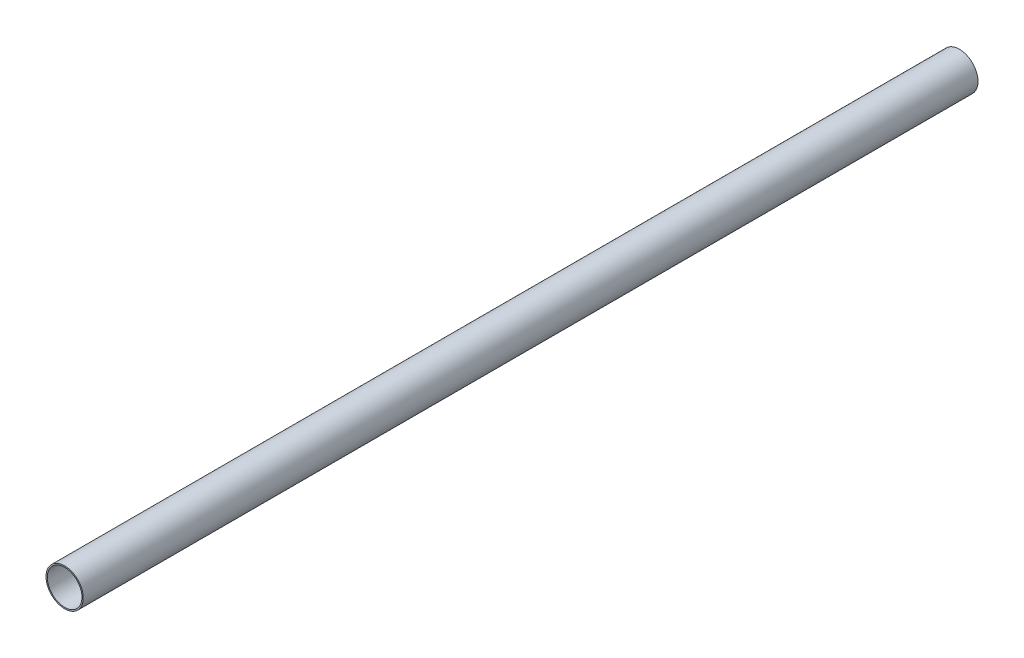
ISO-10303-21;
HEADER;
FILE_DESCRIPTION(('STEP AP214'),'2;1');
FILE_NAME('part.step','',(''),(''),'','','');
FILE_SCHEMA(('AUTOMOTIVE_DESIGN { 1 0 10303 214 1 1 1 1 }'));
ENDSEC;
DATA;
#1=APPLICATION_CONTEXT('core data for automotive mechanical design processes');
#2=APPLICATION_PROTOCOL_DEFINITION('international standard','automotive_design',2000,#1);
#3=PRODUCT_CONTEXT('',#1,'mechanical');
#4=PRODUCT('Part','Part','',(#3));
#5=PRODUCT_RELATED_PRODUCT_CATEGORY('part','',(#4));
#6=PRODUCT_DEFINITION_FORMATION('','',#4);
#7=PRODUCT_DEFINITION_CONTEXT('part definition',#1,'design');
#8=PRODUCT_DEFINITION('design','',#6,#7);
#9=PRODUCT_DEFINITION_SHAPE('','',#8);
#10=(LENGTH_UNIT() NAMED_UNIT(*) SI_UNIT(.MILLI.,.METRE.));
#11=(NAMED_UNIT(*) PLANE_ANGLE_UNIT() SI_UNIT($,.RADIAN.));
#12=(NAMED_UNIT(*) SI_UNIT($,.STERADIAN.) SOLID_ANGLE_UNIT());
#13=UNCERTAINTY_MEASURE_WITH_UNIT(LENGTH_MEASURE(1.E-05),#10,'distance_accuracy_value','');
#14=(GEOMETRIC_REPRESENTATION_CONTEXT(3) GLOBAL_UNCERTAINTY_ASSIGNED_CONTEXT((#13)) GLOBAL_UNIT_ASSIGNED_CONTEXT((#10,
#11,#12)) REPRESENTATION_CONTEXT('',''));
#15=CARTESIAN_POINT('',(0.,0.,0.));
#16=DIRECTION('',(0.,0.,1.));
#17=DIRECTION('',(1.,0.,0.));
#18=AXIS2_PLACEMENT_3D('',#15,#16,#17);
#19=CARTESIAN_POINT('',(0.,0.,304.8));
#20=DIRECTION('',(0.,0.,1.));
#21=DIRECTION('',(1.,0.,0.));
#22=AXIS2_PLACEMENT_3D('',#19,#20,#21);
#23=PLANE('',#22);
#24=CARTESIAN_POINT('',(0.,0.,304.8));
#25=DIRECTION('',(0.,0.,1.));
#26=DIRECTION('',(1.,0.,0.));
#27=AXIS2_PLACEMENT_3D('',#24,#25,#26);
#28=CIRCLE('',#27,12.7);
#29=CARTESIAN_POINT('',(-12.7,0.,304.8));
#30=VERTEX_POINT('',#29);
#31=EDGE_CURVE('E10',#30,#30,#28,.T.);
#32=ORIENTED_EDGE('',*,*,#31,.T.);
#33=EDGE_LOOP('',(#32));
#34=FACE_BOUND('',#33,.T.);
#35=CARTESIAN_POINT('',(0.,0.,304.8));
#36=DIRECTION('',(0.,0.,1.));
#37=DIRECTION('',(1.,0.,0.));
#38=AXIS2_PLACEMENT_3D('',#35,#36,#37);
#39=CIRCLE('',#38,11.811);
#40=CARTESIAN_POINT('',(-11.811,0.,304.8));
#41=VERTEX_POINT('',#40);
#42=EDGE_CURVE('E54',#41,#41,#39,.T.);
#43=ORIENTED_EDGE('',*,*,#42,.F.);
#44=EDGE_LOOP('',(#43));
#45=FACE_BOUND('',#44,.T.);
#46=ADVANCED_FACE('F39',(#34,#45),#23,.T.);
#47=CARTESIAN_POINT('',(0.,0.,-304.8));
#48=DIRECTION('',(0.,0.,1.));
#49=DIRECTION('',(1.,0.,0.));
#50=AXIS2_PLACEMENT_3D('',#47,#48,#49);
#51=PLANE('',#50);
#52=CARTESIAN_POINT('',(0.,0.,-304.8));
#53=DIRECTION('',(0.,0.,1.));
#54=DIRECTION('',(1.,0.,0.));
#55=AXIS2_PLACEMENT_3D('',#52,#53,#54);
#56=CIRCLE('',#55,12.7);
#57=CARTESIAN_POINT('',(-12.7,0.,-304.8));
#58=VERTEX_POINT('',#57);
#59=EDGE_CURVE('E43',#58,#58,#56,.T.);
#60=ORIENTED_EDGE('',*,*,#59,.F.);
#61=EDGE_LOOP('',(#60));
#62=FACE_BOUND('',#61,.T.);
#63=CARTESIAN_POINT('',(0.,0.,-304.8));
#64=DIRECTION('',(0.,0.,1.));
#65=DIRECTION('',(1.,0.,0.));
#66=AXIS2_PLACEMENT_3D('',#63,#64,#65);
#67=CIRCLE('',#66,11.811);
#68=CARTESIAN_POINT('',(-11.811,0.,-304.8));
#69=VERTEX_POINT('',#68);
#70=EDGE_CURVE('E56',#69,#69,#67,.T.);
#71=ORIENTED_EDGE('',*,*,#70,.T.);
#72=EDGE_LOOP('',(#71));
#73=FACE_BOUND('',#72,.T.);
#74=ADVANCED_FACE('F66',(#62,#73),#51,.F.);
#75=CARTESIAN_POINT('',(0.,0.,304.8));
#76=DIRECTION('',(0.,0.,-1.));
#77=DIRECTION('',(-1.,0.,0.));
#78=AXIS2_PLACEMENT_3D('',#75,#76,#77);
#79=CYLINDRICAL_SURFACE('',#78,12.7);
#80=CARTESIAN_POINT('',(-12.7,0.,304.8));
#81=CARTESIAN_POINT('',(-12.7,0.,298.45));
#82=CARTESIAN_POINT('',(-12.7,0.,292.1));
#83=CARTESIAN_POINT('',(-12.7,0.,279.4));
#84=CARTESIAN_POINT('',(-12.7,0.,273.05));
#85=CARTESIAN_POINT('',(-12.7,0.,260.35));
#86=CARTESIAN_POINT('',(-12.7,0.,254.));
#87=CARTESIAN_POINT('',(-12.7,0.,241.3));
#88=CARTESIAN_POINT('',(-12.7,0.,234.95));
#89=CARTESIAN_POINT('',(-12.7,0.,222.25));
#90=CARTESIAN_POINT('',(-12.7,0.,215.9));
#91=CARTESIAN_POINT('',(-12.7,0.,203.2));
#92=CARTESIAN_POINT('',(-12.7,0.,196.85));
#93=CARTESIAN_POINT('',(-12.7,0.,184.15));
#94=CARTESIAN_POINT('',(-12.7,0.,177.8));
#95=CARTESIAN_POINT('',(-12.7,0.,165.1));
#96=CARTESIAN_POINT('',(-12.7,0.,158.75));
#97=CARTESIAN_POINT('',(-12.7,0.,146.05));
#98=CARTESIAN_POINT('',(-12.7,0.,139.7));
#99=CARTESIAN_POINT('',(-12.7,0.,127.));
#100=CARTESIAN_POINT('',(-12.7,0.,120.65));
#101=CARTESIAN_POINT('',(-12.7,0.,107.95));
#102=CARTESIAN_POINT('',(-12.7,0.,101.6));
#103=CARTESIAN_POINT('',(-12.7,0.,88.9));
#104=CARTESIAN_POINT('',(-12.7,0.,82.55));
#105=CARTESIAN_POINT('',(-12.7,0.,69.85));
#106=CARTESIAN_POINT('',(-12.7,0.,63.5));
#107=CARTESIAN_POINT('',(-12.7,0.,50.8));
#108=CARTESIAN_POINT('',(-12.7,0.,44.45));
#109=CARTESIAN_POINT('',(-12.7,0.,31.75));
#110=CARTESIAN_POINT('',(-12.7,0.,25.4));
#111=CARTESIAN_POINT('',(-12.7,0.,12.7));
#112=CARTESIAN_POINT('',(-12.7,0.,6.35));
#113=CARTESIAN_POINT('',(-12.7,0.,-6.35));
#114=CARTESIAN_POINT('',(-12.7,0.,-12.7));
#115=CARTESIAN_POINT('',(-12.7,0.,-25.4));
#116=CARTESIAN_POINT('',(-12.7,0.,-31.75));
#117=CARTESIAN_POINT('',(-12.7,0.,-44.45));
#118=CARTESIAN_POINT('',(-12.7,0.,-50.8));
#119=CARTESIAN_POINT('',(-12.7,0.,-63.5));
#120=CARTESIAN_POINT('',(-12.7,0.,-69.85));
#121=CARTESIAN_POINT('',(-12.7,0.,-82.55));
#122=CARTESIAN_POINT('',(-12.7,0.,-88.9));
#123=CARTESIAN_POINT('',(-12.7,0.,-101.6));
#124=CARTESIAN_POINT('',(-12.7,0.,-107.95));
#125=CARTESIAN_POINT('',(-12.7,0.,-120.65));
#126=CARTESIAN_POINT('',(-12.7,0.,-127.));
#127=CARTESIAN_POINT('',(-12.7,0.,-139.7));
#128=CARTESIAN_POINT('',(-12.7,0.,-146.05));
#129=CARTESIAN_POINT('',(-12.7,0.,-158.75));
#130=CARTESIAN_POINT('',(-12.7,0.,-165.1));
#131=CARTESIAN_POINT('',(-12.7,0.,-177.8));
#132=CARTESIAN_POINT('',(-12.7,0.,-184.15));
#133=CARTESIAN_POINT('',(-12.7,0.,-196.85));
#134=CARTESIAN_POINT('',(-12.7,0.,-203.2));
#135=CARTESIAN_POINT('',(-12.7,0.,-215.9));
#136=CARTESIAN_POINT('',(-12.7,0.,-222.25));
#137=CARTESIAN_POINT('',(-12.7,0.,-234.95));
#138=CARTESIAN_POINT('',(-12.7,0.,-241.3));
#139=CARTESIAN_POINT('',(-12.7,0.,-254.));
#140=CARTESIAN_POINT('',(-12.7,0.,-260.35));
#141=CARTESIAN_POINT('',(-12.7,0.,-273.05));
#142=CARTESIAN_POINT('',(-12.7,0.,-279.4));
#143=CARTESIAN_POINT('',(-12.7,0.,-292.1));
#144=CARTESIAN_POINT('',(-12.7,0.,-298.45));
#145=CARTESIAN_POINT('',(-12.7,0.,-304.8));
#146=B_SPLINE_CURVE_WITH_KNOTS('',3,(#80,#81,#82,#83,#84,#85,#86,#87,#88,#89,#90,#91,#92,#93,
#94,#95,#96,#97,#98,#99,#100,#101,#102,#103,#104,#105,#106,#107,#108,#109,#110,#111,#112,#113,
#114,#115,#116,#117,#118,#119,#120,#121,#122,#123,#124,#125,#126,#127,#128,#129,#130,#131,#132,
#133,#134,#135,#136,#137,#138,#139,#140,#141,#142,#143,#144,#145),.UNSPECIFIED.,.F.,.F.,(4,2,2,
2,2,2,2,2,2,2,2,2,2,2,2,2,2,2,2,2,2,2,2,2,2,2,2,2,2,2,2,2,4),(0.,19.05,38.1,57.15,76.2,
95.2500000000001,114.3,133.35,152.4,171.45,190.5,209.55,228.6,247.65,266.7,285.75,304.8,323.85,
342.9,361.95,381.,400.05,419.1,438.15,457.2,476.25,495.3,514.35,533.4,552.45,571.5,590.55,
609.6),.UNSPECIFIED.);
#147=EDGE_CURVE('BSEAM41',#30,#58,#146,.T.);
#148=ORIENTED_EDGE('',*,*,#31,.F.);
#149=ORIENTED_EDGE('',*,*,#59,.T.);
#150=ORIENTED_EDGE('',*,*,#147,.T.);
#151=ORIENTED_EDGE('',*,*,#147,.F.);
#152=EDGE_LOOP('',(#148,#150,#149,#151));
#153=FACE_BOUND('',#152,.T.);
#154=ADVANCED_FACE('F41',(#153),#79,.T.);
#155=CARTESIAN_POINT('',(0.,0.,304.8));
#156=DIRECTION('',(0.,0.,-1.));
#157=DIRECTION('',(-1.,0.,0.));
#158=AXIS2_PLACEMENT_3D('',#155,#156,#157);
#159=CYLINDRICAL_SURFACE('',#158,11.811);
#160=CARTESIAN_POINT('',(-11.811,0.,304.8));
#161=CARTESIAN_POINT('',(-11.811,0.,298.45));
#162=CARTESIAN_POINT('',(-11.811,0.,292.1));
#163=CARTESIAN_POINT('',(-11.811,0.,279.4));
#164=CARTESIAN_POINT('',(-11.811,0.,273.05));
#165=CARTESIAN_POINT('',(-11.811,0.,260.35));
#166=CARTESIAN_POINT('',(-11.811,0.,254.));
#167=CARTESIAN_POINT('',(-11.811,0.,241.3));
#168=CARTESIAN_POINT('',(-11.811,0.,234.95));
#169=CARTESIAN_POINT('',(-11.811,0.,222.25));
#170=CARTESIAN_POINT('',(-11.811,0.,215.9));
#171=CARTESIAN_POINT('',(-11.811,0.,203.2));
#172=CARTESIAN_POINT('',(-11.811,0.,196.85));
#173=CARTESIAN_POINT('',(-11.811,0.,184.15));
#174=CARTESIAN_POINT('',(-11.811,0.,177.8));
#175=CARTESIAN_POINT('',(-11.811,0.,165.1));
#176=CARTESIAN_POINT('',(-11.811,0.,158.75));
#177=CARTESIAN_POINT('',(-11.811,0.,146.05));
#178=CARTESIAN_POINT('',(-11.811,0.,139.7));
#179=CARTESIAN_POINT('',(-11.811,0.,127.));
#180=CARTESIAN_POINT('',(-11.811,0.,120.65));
#181=CARTESIAN_POINT('',(-11.811,0.,107.95));
#182=CARTESIAN_POINT('',(-11.811,0.,101.6));
#183=CARTESIAN_POINT('',(-11.811,0.,88.9));
#184=CARTESIAN_POINT('',(-11.811,0.,82.55));
#185=CARTESIAN_POINT('',(-11.811,0.,69.85));
#186=CARTESIAN_POINT('',(-11.811,0.,63.5));
#187=CARTESIAN_POINT('',(-11.811,0.,50.8));
#188=CARTESIAN_POINT('',(-11.811,0.,44.45));
#189=CARTESIAN_POINT('',(-11.811,0.,31.75));
#190=CARTESIAN_POINT('',(-11.811,0.,25.4));
#191=CARTESIAN_POINT('',(-11.811,0.,12.7));
#192=CARTESIAN_POINT('',(-11.811,0.,6.35));
#193=CARTESIAN_POINT('',(-11.811,0.,-6.35));
#194=CARTESIAN_POINT('',(-11.811,0.,-12.7));
#195=CARTESIAN_POINT('',(-11.811,0.,-25.4));
#196=CARTESIAN_POINT('',(-11.811,0.,-31.75));
#197=CARTESIAN_POINT('',(-11.811,0.,-44.45));
#198=CARTESIAN_POINT('',(-11.811,0.,-50.8));
#199=CARTESIAN_POINT('',(-11.811,0.,-63.5));
#200=CARTESIAN_POINT('',(-11.811,0.,-69.85));
#201=CARTESIAN_POINT('',(-11.811,0.,-82.55));
#202=CARTESIAN_POINT('',(-11.811,0.,-88.9));
#203=CARTESIAN_POINT('',(-11.811,0.,-101.6));
#204=CARTESIAN_POINT('',(-11.811,0.,-107.95));
#205=CARTESIAN_POINT('',(-11.811,0.,-120.65));
#206=CARTESIAN_POINT('',(-11.811,0.,-127.));
#207=CARTESIAN_POINT('',(-11.811,0.,-139.7));
#208=CARTESIAN_POINT('',(-11.811,0.,-146.05));
#209=CARTESIAN_POINT('',(-11.811,0.,-158.75));
#210=CARTESIAN_POINT('',(-11.811,0.,-165.1));
#211=CARTESIAN_POINT('',(-11.811,0.,-177.8));
#212=CARTESIAN_POINT('',(-11.811,0.,-184.15));
#213=CARTESIAN_POINT('',(-11.811,0.,-196.85));
#214=CARTESIAN_POINT('',(-11.811,0.,-203.2));
#215=CARTESIAN_POINT('',(-11.811,0.,-215.9));
#216=CARTESIAN_POINT('',(-11.811,0.,-222.25));
#217=CARTESIAN_POINT('',(-11.811,0.,-234.95));
#218=CARTESIAN_POINT('',(-11.811,0.,-241.3));
#219=CARTESIAN_POINT('',(-11.811,0.,-254.));
#220=CARTESIAN_POINT('',(-11.811,0.,-260.35));
#221=CARTESIAN_POINT('',(-11.811,0.,-273.05));
#222=CARTESIAN_POINT('',(-11.811,0.,-279.4));
#223=CARTESIAN_POINT('',(-11.811,0.,-292.1));
#224=CARTESIAN_POINT('',(-11.811,0.,-298.45));
#225=CARTESIAN_POINT('',(-11.811,0.,-304.8));
#226=B_SPLINE_CURVE_WITH_KNOTS('',3,(#160,#161,#162,#163,#164,#165,#166,#167,#168,#169,#170,
#171,#172,#173,#174,#175,#176,#177,#178,#179,#180,#181,#182,#183,#184,#185,#186,#187,#188,#189,
#190,#191,#192,#193,#194,#195,#196,#197,#198,#199,#200,#201,#202,#203,#204,#205,#206,#207,#208,
#209,#210,#211,#212,#213,#214,#215,#216,#217,#218,#219,#220,#221,#222,#223,#224,#225),
.UNSPECIFIED.,.F.,.F.,(4,2,2,2,2,2,2,2,2,2,2,2,2,2,2,2,2,2,2,2,2,2,2,2,2,2,2,2,2,2,2,2,4),(0.,
19.05,38.1,57.15,76.2,95.2500000000001,114.3,133.35,152.4,171.45,190.5,209.55,228.6,247.65,
266.7,285.75,304.8,323.85,342.9,361.95,381.,400.05,419.1,438.15,457.2,476.25,495.3,514.35,533.4,
552.45,571.5,590.55,609.6),.UNSPECIFIED.);
#227=EDGE_CURVE('BSEAM62',#41,#69,#226,.T.);
#228=ORIENTED_EDGE('',*,*,#42,.T.);
#229=ORIENTED_EDGE('',*,*,#70,.F.);
#230=ORIENTED_EDGE('',*,*,#227,.T.);
#231=ORIENTED_EDGE('',*,*,#227,.F.);
#232=EDGE_LOOP('',(#228,#230,#229,#231));
#233=FACE_BOUND('',#232,.T.);
#234=ADVANCED_FACE('F62',(#233),#159,.F.);
#235=CLOSED_SHELL('',(#46,#74,#154,#234));
#236=MANIFOLD_SOLID_BREP('B2',#235);
#237=ADVANCED_BREP_SHAPE_REPRESENTATION('',(#18,#236),#14);
#238=SHAPE_DEFINITION_REPRESENTATION(#9,#237);
ENDSEC;
END-ISO-10303-21;
